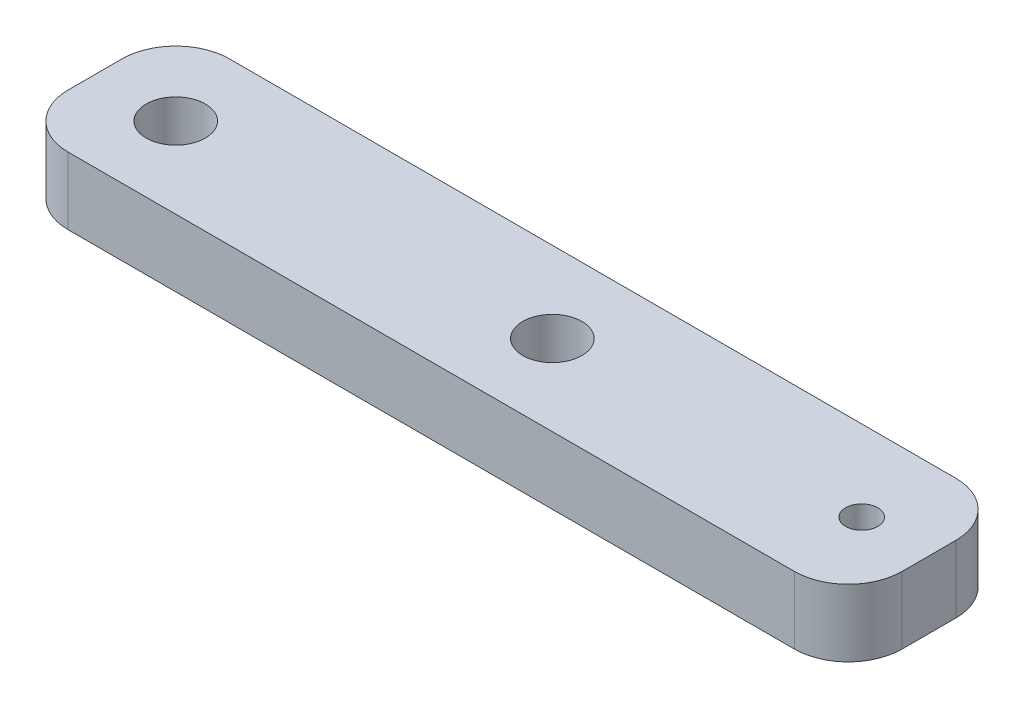
ISO-10303-21;
HEADER;
FILE_DESCRIPTION(('STEP AP214'),'2;1');
FILE_NAME('part.step','',(''),(''),'','','');
FILE_SCHEMA(('AUTOMOTIVE_DESIGN { 1 0 10303 214 1 1 1 1 }'));
ENDSEC;
DATA;
#1=APPLICATION_CONTEXT('core data for automotive mechanical design processes');
#2=APPLICATION_PROTOCOL_DEFINITION('international standard','automotive_design',2000,#1);
#3=PRODUCT_CONTEXT('',#1,'mechanical');
#4=PRODUCT('Part','Part','',(#3));
#5=PRODUCT_RELATED_PRODUCT_CATEGORY('part','',(#4));
#6=PRODUCT_DEFINITION_FORMATION('','',#4);
#7=PRODUCT_DEFINITION_CONTEXT('part definition',#1,'design');
#8=PRODUCT_DEFINITION('design','',#6,#7);
#9=PRODUCT_DEFINITION_SHAPE('','',#8);
#10=(LENGTH_UNIT() NAMED_UNIT(*) SI_UNIT(.MILLI.,.METRE.));
#11=(NAMED_UNIT(*) PLANE_ANGLE_UNIT() SI_UNIT($,.RADIAN.));
#12=(NAMED_UNIT(*) SI_UNIT($,.STERADIAN.) SOLID_ANGLE_UNIT());
#13=UNCERTAINTY_MEASURE_WITH_UNIT(LENGTH_MEASURE(1.E-05),#10,'distance_accuracy_value','');
#14=(GEOMETRIC_REPRESENTATION_CONTEXT(3) GLOBAL_UNCERTAINTY_ASSIGNED_CONTEXT((#13)) GLOBAL_UNIT_ASSIGNED_CONTEXT((#10,
#11,#12)) REPRESENTATION_CONTEXT('',''));
#15=CARTESIAN_POINT('',(0.,0.,0.));
#16=DIRECTION('',(0.,0.,1.));
#17=DIRECTION('',(1.,0.,0.));
#18=AXIS2_PLACEMENT_3D('',#15,#16,#17);
#19=CARTESIAN_POINT('',(0.,2.5,-0.358503659513823));
#20=DIRECTION('',(1.,0.,0.));
#21=DIRECTION('',(0.,0.,-1.));
#22=AXIS2_PLACEMENT_3D('',#19,#20,#21);
#23=PLANE('',#22);
#24=DIRECTION('',(0.,0.,1.));
#25=VECTOR('',#24,1.);
#26=CARTESIAN_POINT('',(0.,2.5,-0.358503659513823));
#27=LINE('',#26,#25);
#28=CARTESIAN_POINT('',(0.,2.5,1.64149634048618));
#29=VERTEX_POINT('',#28);
#30=CARTESIAN_POINT('',(0.,2.5,3.64149634048618));
#31=VERTEX_POINT('',#30);
#32=EDGE_CURVE('E120',#29,#31,#27,.T.);
#33=ORIENTED_EDGE('',*,*,#32,.F.);
#34=DIRECTION('',(0.,-1.,0.));
#35=VECTOR('',#34,1.);
#36=CARTESIAN_POINT('',(0.,2.5,1.64149634048618));
#37=LINE('',#36,#35);
#38=CARTESIAN_POINT('',(0.,0.,1.64149634048618));
#39=VERTEX_POINT('',#38);
#40=EDGE_CURVE('E105',#29,#39,#37,.T.);
#41=ORIENTED_EDGE('',*,*,#40,.T.);
#42=DIRECTION('',(0.,0.,1.));
#43=VECTOR('',#42,1.);
#44=CARTESIAN_POINT('',(0.,0.,-0.358503659513823));
#45=LINE('',#44,#43);
#46=CARTESIAN_POINT('',(0.,0.,3.64149634048618));
#47=VERTEX_POINT('',#46);
#48=EDGE_CURVE('E117',#39,#47,#45,.T.);
#49=ORIENTED_EDGE('',*,*,#48,.T.);
#50=DIRECTION('',(0.,-1.,0.));
#51=VECTOR('',#50,1.);
#52=CARTESIAN_POINT('',(0.,2.5,3.64149634048618));
#53=LINE('',#52,#51);
#54=EDGE_CURVE('E122',#47,#31,#53,.F.);
#55=ORIENTED_EDGE('',*,*,#54,.T.);
#56=EDGE_LOOP('',(#33,#41,#49,#55));
#57=FACE_BOUND('',#56,.T.);
#58=ADVANCED_FACE('F35',(#57),#23,.F.);
#59=CARTESIAN_POINT('',(0.,2.5,5.64149634048618));
#60=DIRECTION('',(0.,0.,-1.));
#61=DIRECTION('',(-1.,0.,0.));
#62=AXIS2_PLACEMENT_3D('',#59,#60,#61);
#63=PLANE('',#62);
#64=DIRECTION('',(1.,0.,0.));
#65=VECTOR('',#64,1.);
#66=CARTESIAN_POINT('',(0.,0.,5.64149634048618));
#67=LINE('',#66,#65);
#68=CARTESIAN_POINT('',(2.,0.,5.64149634048618));
#69=VERTEX_POINT('',#68);
#70=CARTESIAN_POINT('',(29.,0.,5.64149634048618));
#71=VERTEX_POINT('',#70);
#72=EDGE_CURVE('E126',#69,#71,#67,.T.);
#73=ORIENTED_EDGE('',*,*,#72,.T.);
#74=DIRECTION('',(0.,-1.,0.));
#75=VECTOR('',#74,1.);
#76=CARTESIAN_POINT('',(29.,2.5,5.64149634048618));
#77=LINE('',#76,#75);
#78=CARTESIAN_POINT('',(29.,2.5,5.64149634048618));
#79=VERTEX_POINT('',#78);
#80=EDGE_CURVE('E11',#71,#79,#77,.F.);
#81=ORIENTED_EDGE('',*,*,#80,.T.);
#82=DIRECTION('',(1.,0.,0.));
#83=VECTOR('',#82,1.);
#84=CARTESIAN_POINT('',(0.,2.5,5.64149634048618));
#85=LINE('',#84,#83);
#86=CARTESIAN_POINT('',(2.,2.5,5.64149634048618));
#87=VERTEX_POINT('',#86);
#88=EDGE_CURVE('E166',#87,#79,#85,.T.);
#89=ORIENTED_EDGE('',*,*,#88,.F.);
#90=DIRECTION('',(0.,-1.,0.));
#91=VECTOR('',#90,1.);
#92=CARTESIAN_POINT('',(2.,2.5,5.64149634048618));
#93=LINE('',#92,#91);
#94=EDGE_CURVE('E43',#87,#69,#93,.T.);
#95=ORIENTED_EDGE('',*,*,#94,.T.);
#96=EDGE_LOOP('',(#73,#81,#89,#95));
#97=FACE_BOUND('',#96,.T.);
#98=ADVANCED_FACE('F164',(#97),#63,.F.);
#99=CARTESIAN_POINT('',(31.,2.5,-0.358503659513823));
#100=DIRECTION('',(-1.,0.,0.));
#101=DIRECTION('',(0.,0.,1.));
#102=AXIS2_PLACEMENT_3D('',#99,#100,#101);
#103=PLANE('',#102);
#104=DIRECTION('',(0.,0.,-1.));
#105=VECTOR('',#104,1.);
#106=CARTESIAN_POINT('',(31.,0.,-0.358503659513823));
#107=LINE('',#106,#105);
#108=CARTESIAN_POINT('',(31.,0.,3.64149634048618));
#109=VERTEX_POINT('',#108);
#110=CARTESIAN_POINT('',(31.,0.,1.64149634048618));
#111=VERTEX_POINT('',#110);
#112=EDGE_CURVE('E130',#109,#111,#107,.T.);
#113=ORIENTED_EDGE('',*,*,#112,.T.);
#114=DIRECTION('',(0.,-1.,0.));
#115=VECTOR('',#114,1.);
#116=CARTESIAN_POINT('',(31.,2.5,1.64149634048618));
#117=LINE('',#116,#115);
#118=CARTESIAN_POINT('',(31.,2.5,1.64149634048618));
#119=VERTEX_POINT('',#118);
#120=EDGE_CURVE('E50',#111,#119,#117,.F.);
#121=ORIENTED_EDGE('',*,*,#120,.T.);
#122=DIRECTION('',(0.,0.,-1.));
#123=VECTOR('',#122,1.);
#124=CARTESIAN_POINT('',(31.,2.5,-0.358503659513823));
#125=LINE('',#124,#123);
#126=CARTESIAN_POINT('',(31.,2.5,3.64149634048618));
#127=VERTEX_POINT('',#126);
#128=EDGE_CURVE('E174',#127,#119,#125,.T.);
#129=ORIENTED_EDGE('',*,*,#128,.F.);
#130=DIRECTION('',(0.,-1.,0.));
#131=VECTOR('',#130,1.);
#132=CARTESIAN_POINT('',(31.,2.5,3.64149634048618));
#133=LINE('',#132,#131);
#134=EDGE_CURVE('E157',#127,#109,#133,.T.);
#135=ORIENTED_EDGE('',*,*,#134,.T.);
#136=EDGE_LOOP('',(#113,#121,#129,#135));
#137=FACE_BOUND('',#136,.T.);
#138=ADVANCED_FACE('F173',(#137),#103,.F.);
#139=CARTESIAN_POINT('',(0.,2.5,-0.358503659513823));
#140=DIRECTION('',(0.,0.,1.));
#141=DIRECTION('',(1.,0.,0.));
#142=AXIS2_PLACEMENT_3D('',#139,#140,#141);
#143=PLANE('',#142);
#144=DIRECTION('',(-1.,0.,0.));
#145=VECTOR('',#144,1.);
#146=CARTESIAN_POINT('',(0.,0.,-0.358503659513823));
#147=LINE('',#146,#145);
#148=CARTESIAN_POINT('',(29.,0.,-0.358503659513823));
#149=VERTEX_POINT('',#148);
#150=CARTESIAN_POINT('',(2.,0.,-0.358503659513823));
#151=VERTEX_POINT('',#150);
#152=EDGE_CURVE('E140',#149,#151,#147,.T.);
#153=ORIENTED_EDGE('',*,*,#152,.T.);
#154=DIRECTION('',(0.,-1.,0.));
#155=VECTOR('',#154,1.);
#156=CARTESIAN_POINT('',(2.,2.5,-0.358503659513823));
#157=LINE('',#156,#155);
#158=CARTESIAN_POINT('',(2.,2.5,-0.358503659513823));
#159=VERTEX_POINT('',#158);
#160=EDGE_CURVE('E106',#151,#159,#157,.F.);
#161=ORIENTED_EDGE('',*,*,#160,.T.);
#162=DIRECTION('',(-1.,0.,0.));
#163=VECTOR('',#162,1.);
#164=CARTESIAN_POINT('',(0.,2.5,-0.358503659513823));
#165=LINE('',#164,#163);
#166=CARTESIAN_POINT('',(29.,2.5,-0.358503659513823));
#167=VERTEX_POINT('',#166);
#168=EDGE_CURVE('E136',#167,#159,#165,.T.);
#169=ORIENTED_EDGE('',*,*,#168,.F.);
#170=DIRECTION('',(0.,-1.,0.));
#171=VECTOR('',#170,1.);
#172=CARTESIAN_POINT('',(29.,2.5,-0.358503659513823));
#173=LINE('',#172,#171);
#174=EDGE_CURVE('E111',#167,#149,#173,.T.);
#175=ORIENTED_EDGE('',*,*,#174,.T.);
#176=EDGE_LOOP('',(#153,#161,#169,#175));
#177=FACE_BOUND('',#176,.T.);
#178=ADVANCED_FACE('F207',(#177),#143,.F.);
#179=CARTESIAN_POINT('',(0.,2.5,0.));
#180=DIRECTION('',(0.,1.,0.));
#181=DIRECTION('',(0.,0.,1.));
#182=AXIS2_PLACEMENT_3D('',#179,#180,#181);
#183=PLANE('',#182);
#184=CARTESIAN_POINT('',(28.5,2.5,2.64149634048618));
#185=DIRECTION('',(0.,1.,0.));
#186=DIRECTION('',(0.,0.,1.));
#187=AXIS2_PLACEMENT_3D('',#184,#185,#186);
#188=CIRCLE('',#187,0.6);
#189=CARTESIAN_POINT('',(28.5,2.5,3.24149634048618));
#190=VERTEX_POINT('',#189);
#191=EDGE_CURVE('E189',#190,#190,#188,.T.);
#192=ORIENTED_EDGE('',*,*,#191,.F.);
#193=EDGE_LOOP('',(#192));
#194=FACE_BOUND('',#193,.T.);
#195=CARTESIAN_POINT('',(17.,2.5,2.64149634048618));
#196=DIRECTION('',(0.,1.,0.));
#197=DIRECTION('',(0.,0.,1.));
#198=AXIS2_PLACEMENT_3D('',#195,#196,#197);
#199=CIRCLE('',#198,1.1);
#200=CARTESIAN_POINT('',(17.,2.5,3.74149634048618));
#201=VERTEX_POINT('',#200);
#202=EDGE_CURVE('E183',#201,#201,#199,.T.);
#203=ORIENTED_EDGE('',*,*,#202,.F.);
#204=EDGE_LOOP('',(#203));
#205=FACE_BOUND('',#204,.T.);
#206=CARTESIAN_POINT('',(3.,2.5,2.64149634048618));
#207=DIRECTION('',(0.,1.,0.));
#208=DIRECTION('',(0.,0.,1.));
#209=AXIS2_PLACEMENT_3D('',#206,#207,#208);
#210=CIRCLE('',#209,1.1);
#211=CARTESIAN_POINT('',(3.,2.5,3.74149634048618));
#212=VERTEX_POINT('',#211);
#213=EDGE_CURVE('E133',#212,#212,#210,.T.);
#214=ORIENTED_EDGE('',*,*,#213,.F.);
#215=EDGE_LOOP('',(#214));
#216=FACE_BOUND('',#215,.T.);
#217=ORIENTED_EDGE('',*,*,#168,.T.);
#218=CARTESIAN_POINT('',(2.,2.5,1.64149634048618));
#219=DIRECTION('',(0.,1.,0.));
#220=DIRECTION('',(0.,0.,1.));
#221=AXIS2_PLACEMENT_3D('',#218,#219,#220);
#222=CIRCLE('',#221,2.);
#223=EDGE_CURVE('E155',#159,#29,#222,.T.);
#224=ORIENTED_EDGE('',*,*,#223,.T.);
#225=ORIENTED_EDGE('',*,*,#32,.T.);
#226=CARTESIAN_POINT('',(2.,2.5,3.64149634048618));
#227=DIRECTION('',(0.,1.,0.));
#228=DIRECTION('',(0.,0.,1.));
#229=AXIS2_PLACEMENT_3D('',#226,#227,#228);
#230=CIRCLE('',#229,2.);
#231=EDGE_CURVE('E150',#31,#87,#230,.T.);
#232=ORIENTED_EDGE('',*,*,#231,.T.);
#233=ORIENTED_EDGE('',*,*,#88,.T.);
#234=CARTESIAN_POINT('',(29.,2.5,3.64149634048618));
#235=DIRECTION('',(0.,1.,0.));
#236=DIRECTION('',(0.,0.,1.));
#237=AXIS2_PLACEMENT_3D('',#234,#235,#236);
#238=CIRCLE('',#237,2.);
#239=EDGE_CURVE('E57',#79,#127,#238,.T.);
#240=ORIENTED_EDGE('',*,*,#239,.T.);
#241=ORIENTED_EDGE('',*,*,#128,.T.);
#242=CARTESIAN_POINT('',(29.,2.5,1.64149634048618));
#243=DIRECTION('',(0.,1.,0.));
#244=DIRECTION('',(0.,0.,1.));
#245=AXIS2_PLACEMENT_3D('',#242,#243,#244);
#246=CIRCLE('',#245,2.);
#247=EDGE_CURVE('E153',#119,#167,#246,.T.);
#248=ORIENTED_EDGE('',*,*,#247,.T.);
#249=EDGE_LOOP('',(#217,#224,#225,#232,#233,#240,#241,#248));
#250=FACE_BOUND('',#249,.T.);
#251=ADVANCED_FACE('F204',(#194,#205,#216,#250),#183,.T.);
#252=CARTESIAN_POINT('',(0.,0.,0.));
#253=DIRECTION('',(0.,1.,0.));
#254=DIRECTION('',(0.,0.,1.));
#255=AXIS2_PLACEMENT_3D('',#252,#253,#254);
#256=PLANE('',#255);
#257=CARTESIAN_POINT('',(28.5,0.,2.64149634048618));
#258=DIRECTION('',(0.,1.,0.));
#259=DIRECTION('',(0.,0.,1.));
#260=AXIS2_PLACEMENT_3D('',#257,#258,#259);
#261=CIRCLE('',#260,0.6);
#262=CARTESIAN_POINT('',(28.5,0.,3.24149634048618));
#263=VERTEX_POINT('',#262);
#264=EDGE_CURVE('E186',#263,#263,#261,.T.);
#265=ORIENTED_EDGE('',*,*,#264,.T.);
#266=EDGE_LOOP('',(#265));
#267=FACE_BOUND('',#266,.T.);
#268=CARTESIAN_POINT('',(17.,0.,2.64149634048618));
#269=DIRECTION('',(0.,1.,0.));
#270=DIRECTION('',(0.,0.,1.));
#271=AXIS2_PLACEMENT_3D('',#268,#269,#270);
#272=CIRCLE('',#271,1.1);
#273=CARTESIAN_POINT('',(17.,0.,3.74149634048618));
#274=VERTEX_POINT('',#273);
#275=EDGE_CURVE('E181',#274,#274,#272,.T.);
#276=ORIENTED_EDGE('',*,*,#275,.T.);
#277=EDGE_LOOP('',(#276));
#278=FACE_BOUND('',#277,.T.);
#279=CARTESIAN_POINT('',(3.,0.,2.64149634048618));
#280=DIRECTION('',(0.,1.,0.));
#281=DIRECTION('',(0.,0.,1.));
#282=AXIS2_PLACEMENT_3D('',#279,#280,#281);
#283=CIRCLE('',#282,1.1);
#284=CARTESIAN_POINT('',(3.,0.,3.74149634048618));
#285=VERTEX_POINT('',#284);
#286=EDGE_CURVE('E127',#285,#285,#283,.T.);
#287=ORIENTED_EDGE('',*,*,#286,.T.);
#288=EDGE_LOOP('',(#287));
#289=FACE_BOUND('',#288,.T.);
#290=ORIENTED_EDGE('',*,*,#48,.F.);
#291=CARTESIAN_POINT('',(2.,0.,1.64149634048618));
#292=DIRECTION('',(0.,1.,0.));
#293=DIRECTION('',(0.,0.,1.));
#294=AXIS2_PLACEMENT_3D('',#291,#292,#293);
#295=CIRCLE('',#294,2.);
#296=EDGE_CURVE('E101',#39,#151,#295,.F.);
#297=ORIENTED_EDGE('',*,*,#296,.T.);
#298=ORIENTED_EDGE('',*,*,#152,.F.);
#299=CARTESIAN_POINT('',(29.,0.,1.64149634048618));
#300=DIRECTION('',(0.,1.,0.));
#301=DIRECTION('',(0.,0.,1.));
#302=AXIS2_PLACEMENT_3D('',#299,#300,#301);
#303=CIRCLE('',#302,2.);
#304=EDGE_CURVE('E112',#149,#111,#303,.F.);
#305=ORIENTED_EDGE('',*,*,#304,.T.);
#306=ORIENTED_EDGE('',*,*,#112,.F.);
#307=CARTESIAN_POINT('',(29.,0.,3.64149634048618));
#308=DIRECTION('',(0.,1.,0.));
#309=DIRECTION('',(0.,0.,1.));
#310=AXIS2_PLACEMENT_3D('',#307,#308,#309);
#311=CIRCLE('',#310,2.);
#312=EDGE_CURVE('E144',#109,#71,#311,.F.);
#313=ORIENTED_EDGE('',*,*,#312,.T.);
#314=ORIENTED_EDGE('',*,*,#72,.F.);
#315=CARTESIAN_POINT('',(2.,0.,3.64149634048618));
#316=DIRECTION('',(0.,1.,0.));
#317=DIRECTION('',(0.,0.,1.));
#318=AXIS2_PLACEMENT_3D('',#315,#316,#317);
#319=CIRCLE('',#318,2.);
#320=EDGE_CURVE('E121',#69,#47,#319,.F.);
#321=ORIENTED_EDGE('',*,*,#320,.T.);
#322=EDGE_LOOP('',(#290,#297,#298,#305,#306,#313,#314,#321));
#323=FACE_BOUND('',#322,.T.);
#324=ADVANCED_FACE('F124',(#267,#278,#289,#323),#256,.F.);
#325=CARTESIAN_POINT('',(3.,0.,2.64149634048618));
#326=DIRECTION('',(0.,1.,0.));
#327=DIRECTION('',(0.,0.,1.));
#328=AXIS2_PLACEMENT_3D('',#325,#326,#327);
#329=CYLINDRICAL_SURFACE('',#328,1.1);
#330=ORIENTED_EDGE('',*,*,#286,.F.);
#331=EDGE_LOOP('',(#330));
#332=FACE_BOUND('',#331,.T.);
#333=ORIENTED_EDGE('',*,*,#213,.T.);
#334=EDGE_LOOP('',(#333));
#335=FACE_BOUND('',#334,.T.);
#336=ADVANCED_FACE('F236',(#332,#335),#329,.F.);
#337=CARTESIAN_POINT('',(17.,0.,2.64149634048618));
#338=DIRECTION('',(0.,1.,0.));
#339=DIRECTION('',(0.,0.,1.));
#340=AXIS2_PLACEMENT_3D('',#337,#338,#339);
#341=CYLINDRICAL_SURFACE('',#340,1.1);
#342=ORIENTED_EDGE('',*,*,#275,.F.);
#343=EDGE_LOOP('',(#342));
#344=FACE_BOUND('',#343,.T.);
#345=ORIENTED_EDGE('',*,*,#202,.T.);
#346=EDGE_LOOP('',(#345));
#347=FACE_BOUND('',#346,.T.);
#348=ADVANCED_FACE('F200',(#344,#347),#341,.F.);
#349=CARTESIAN_POINT('',(28.5,0.,2.64149634048618));
#350=DIRECTION('',(0.,1.,0.));
#351=DIRECTION('',(0.,0.,1.));
#352=AXIS2_PLACEMENT_3D('',#349,#350,#351);
#353=CYLINDRICAL_SURFACE('',#352,0.6);
#354=ORIENTED_EDGE('',*,*,#264,.F.);
#355=EDGE_LOOP('',(#354));
#356=FACE_BOUND('',#355,.T.);
#357=ORIENTED_EDGE('',*,*,#191,.T.);
#358=EDGE_LOOP('',(#357));
#359=FACE_BOUND('',#358,.T.);
#360=ADVANCED_FACE('F197',(#356,#359),#353,.F.);
#361=CARTESIAN_POINT('',(2.,2.5,1.64149634048618));
#362=DIRECTION('',(0.,-1.,0.));
#363=DIRECTION('',(0.,0.,-1.));
#364=AXIS2_PLACEMENT_3D('',#361,#362,#363);
#365=CYLINDRICAL_SURFACE('',#364,2.);
#366=ORIENTED_EDGE('',*,*,#223,.F.);
#367=ORIENTED_EDGE('',*,*,#160,.F.);
#368=ORIENTED_EDGE('',*,*,#296,.F.);
#369=ORIENTED_EDGE('',*,*,#40,.F.);
#370=EDGE_LOOP('',(#366,#367,#368,#369));
#371=FACE_BOUND('',#370,.T.);
#372=ADVANCED_FACE('F104',(#371),#365,.T.);
#373=CARTESIAN_POINT('',(29.,2.5,1.64149634048618));
#374=DIRECTION('',(0.,-1.,0.));
#375=DIRECTION('',(0.,0.,-1.));
#376=AXIS2_PLACEMENT_3D('',#373,#374,#375);
#377=CYLINDRICAL_SURFACE('',#376,2.);
#378=ORIENTED_EDGE('',*,*,#247,.F.);
#379=ORIENTED_EDGE('',*,*,#120,.F.);
#380=ORIENTED_EDGE('',*,*,#304,.F.);
#381=ORIENTED_EDGE('',*,*,#174,.F.);
#382=EDGE_LOOP('',(#378,#379,#380,#381));
#383=FACE_BOUND('',#382,.T.);
#384=ADVANCED_FACE('F216',(#383),#377,.T.);
#385=CARTESIAN_POINT('',(29.,2.5,3.64149634048618));
#386=DIRECTION('',(0.,-1.,0.));
#387=DIRECTION('',(0.,0.,-1.));
#388=AXIS2_PLACEMENT_3D('',#385,#386,#387);
#389=CYLINDRICAL_SURFACE('',#388,2.);
#390=ORIENTED_EDGE('',*,*,#239,.F.);
#391=ORIENTED_EDGE('',*,*,#80,.F.);
#392=ORIENTED_EDGE('',*,*,#312,.F.);
#393=ORIENTED_EDGE('',*,*,#134,.F.);
#394=EDGE_LOOP('',(#390,#391,#392,#393));
#395=FACE_BOUND('',#394,.T.);
#396=ADVANCED_FACE('F172',(#395),#389,.T.);
#397=CARTESIAN_POINT('',(2.,2.5,3.64149634048618));
#398=DIRECTION('',(0.,-1.,0.));
#399=DIRECTION('',(0.,0.,-1.));
#400=AXIS2_PLACEMENT_3D('',#397,#398,#399);
#401=CYLINDRICAL_SURFACE('',#400,2.);
#402=ORIENTED_EDGE('',*,*,#231,.F.);
#403=ORIENTED_EDGE('',*,*,#54,.F.);
#404=ORIENTED_EDGE('',*,*,#320,.F.);
#405=ORIENTED_EDGE('',*,*,#94,.F.);
#406=EDGE_LOOP('',(#402,#403,#404,#405));
#407=FACE_BOUND('',#406,.T.);
#408=ADVANCED_FACE('F37',(#407),#401,.T.);
#409=CLOSED_SHELL('',(#58,#98,#138,#178,#251,#324,#336,#348,#360,#372,#384,#396,#408));
#410=MANIFOLD_SOLID_BREP('B2',#409);
#411=ADVANCED_BREP_SHAPE_REPRESENTATION('',(#18,#410),#14);
#412=SHAPE_DEFINITION_REPRESENTATION(#9,#411);
ENDSEC;
END-ISO-10303-21;
